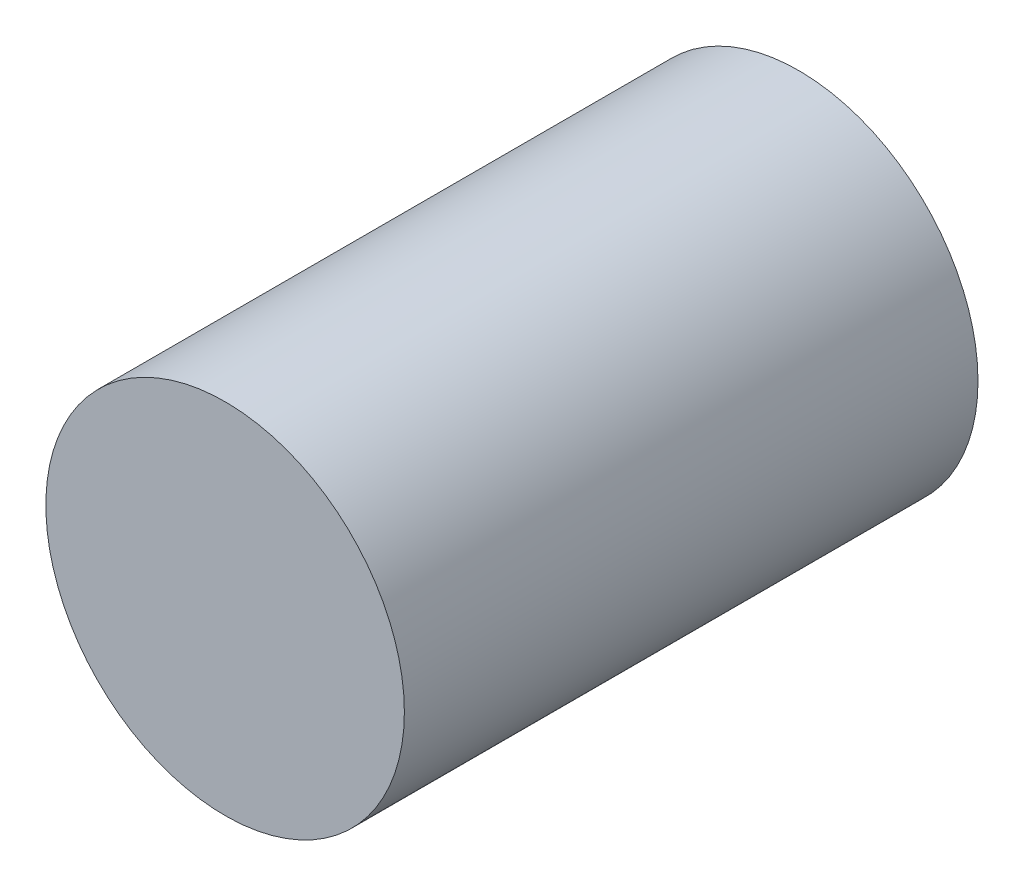
ISO-10303-21;
HEADER;
FILE_DESCRIPTION(('STEP AP214'),'2;1');
FILE_NAME('part.step','',(''),(''),'','','');
FILE_SCHEMA(('AUTOMOTIVE_DESIGN { 1 0 10303 214 1 1 1 1 }'));
ENDSEC;
DATA;
#1=APPLICATION_CONTEXT('core data for automotive mechanical design processes');
#2=APPLICATION_PROTOCOL_DEFINITION('international standard','automotive_design',2000,#1);
#3=PRODUCT_CONTEXT('',#1,'mechanical');
#4=PRODUCT('Part','Part','',(#3));
#5=PRODUCT_RELATED_PRODUCT_CATEGORY('part','',(#4));
#6=PRODUCT_DEFINITION_FORMATION('','',#4);
#7=PRODUCT_DEFINITION_CONTEXT('part definition',#1,'design');
#8=PRODUCT_DEFINITION('design','',#6,#7);
#9=PRODUCT_DEFINITION_SHAPE('','',#8);
#10=(LENGTH_UNIT() NAMED_UNIT(*) SI_UNIT(.MILLI.,.METRE.));
#11=(NAMED_UNIT(*) PLANE_ANGLE_UNIT() SI_UNIT($,.RADIAN.));
#12=(NAMED_UNIT(*) SI_UNIT($,.STERADIAN.) SOLID_ANGLE_UNIT());
#13=UNCERTAINTY_MEASURE_WITH_UNIT(LENGTH_MEASURE(1.E-05),#10,'distance_accuracy_value','');
#14=(GEOMETRIC_REPRESENTATION_CONTEXT(3) GLOBAL_UNCERTAINTY_ASSIGNED_CONTEXT((#13)) GLOBAL_UNIT_ASSIGNED_CONTEXT((#10,
#11,#12)) REPRESENTATION_CONTEXT('',''));
#15=CARTESIAN_POINT('',(0.,0.,0.));
#16=DIRECTION('',(0.,0.,1.));
#17=DIRECTION('',(1.,0.,0.));
#18=AXIS2_PLACEMENT_3D('',#15,#16,#17);
#19=CARTESIAN_POINT('',(0.,0.,24.));
#20=DIRECTION('',(0.,0.,-1.));
#21=DIRECTION('',(-1.,0.,0.));
#22=AXIS2_PLACEMENT_3D('',#19,#20,#21);
#23=CYLINDRICAL_SURFACE('',#22,7.5);
#24=CARTESIAN_POINT('',(0.,0.,24.));
#25=DIRECTION('',(0.,0.,1.));
#26=DIRECTION('',(1.,0.,0.));
#27=AXIS2_PLACEMENT_3D('',#24,#25,#26);
#28=CIRCLE('',#27,7.5);
#29=CARTESIAN_POINT('',(7.5,0.,24.));
#30=VERTEX_POINT('',#29);
#31=EDGE_CURVE('E10',#30,#30,#28,.T.);
#32=ORIENTED_EDGE('',*,*,#31,.F.);
#33=EDGE_LOOP('',(#32));
#34=FACE_BOUND('',#33,.T.);
#35=CARTESIAN_POINT('',(0.,0.,0.));
#36=DIRECTION('',(0.,0.,1.));
#37=DIRECTION('',(1.,0.,0.));
#38=AXIS2_PLACEMENT_3D('',#35,#36,#37);
#39=CIRCLE('',#38,7.5);
#40=CARTESIAN_POINT('',(7.5,0.,0.));
#41=VERTEX_POINT('',#40);
#42=EDGE_CURVE('E35',#41,#41,#39,.T.);
#43=ORIENTED_EDGE('',*,*,#42,.T.);
#44=EDGE_LOOP('',(#43));
#45=FACE_BOUND('',#44,.T.);
#46=ADVANCED_FACE('F32',(#34,#45),#23,.T.);
#47=CARTESIAN_POINT('',(0.,0.,24.));
#48=DIRECTION('',(0.,0.,1.));
#49=DIRECTION('',(1.,0.,0.));
#50=AXIS2_PLACEMENT_3D('',#47,#48,#49);
#51=PLANE('',#50);
#52=ORIENTED_EDGE('',*,*,#31,.T.);
#53=EDGE_LOOP('',(#52));
#54=FACE_BOUND('',#53,.T.);
#55=ADVANCED_FACE('F47',(#54),#51,.T.);
#56=CARTESIAN_POINT('',(0.,0.,0.));
#57=DIRECTION('',(0.,0.,1.));
#58=DIRECTION('',(1.,0.,0.));
#59=AXIS2_PLACEMENT_3D('',#56,#57,#58);
#60=PLANE('',#59);
#61=ORIENTED_EDGE('',*,*,#42,.F.);
#62=EDGE_LOOP('',(#61));
#63=FACE_BOUND('',#62,.T.);
#64=ADVANCED_FACE('F45',(#63),#60,.F.);
#65=CLOSED_SHELL('',(#46,#55,#64));
#66=MANIFOLD_SOLID_BREP('B2',#65);
#67=ADVANCED_BREP_SHAPE_REPRESENTATION('',(#18,#66),#14);
#68=SHAPE_DEFINITION_REPRESENTATION(#9,#67);
ENDSEC;
END-ISO-10303-21;
